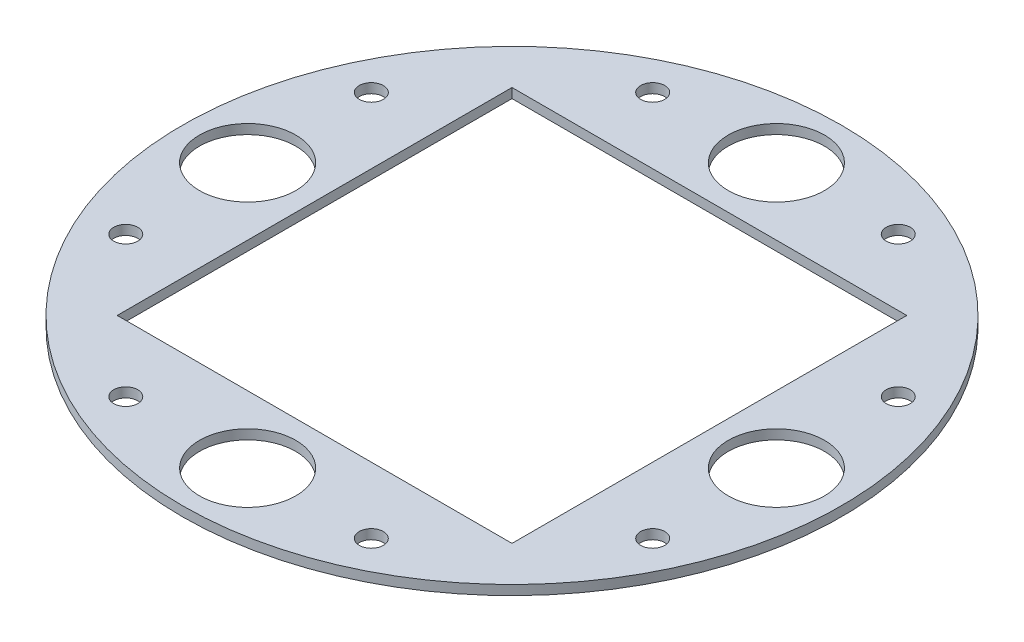
ISO-10303-21;
HEADER;
FILE_DESCRIPTION(('STEP AP214'),'2;1');
FILE_NAME('part.step','',(''),(''),'','','');
FILE_SCHEMA(('AUTOMOTIVE_DESIGN { 1 0 10303 214 1 1 1 1 }'));
ENDSEC;
DATA;
#1=APPLICATION_CONTEXT('core data for automotive mechanical design processes');
#2=APPLICATION_PROTOCOL_DEFINITION('international standard','automotive_design',2000,#1);
#3=PRODUCT_CONTEXT('',#1,'mechanical');
#4=PRODUCT('Part','Part','',(#3));
#5=PRODUCT_RELATED_PRODUCT_CATEGORY('part','',(#4));
#6=PRODUCT_DEFINITION_FORMATION('','',#4);
#7=PRODUCT_DEFINITION_CONTEXT('part definition',#1,'design');
#8=PRODUCT_DEFINITION('design','',#6,#7);
#9=PRODUCT_DEFINITION_SHAPE('','',#8);
#10=(LENGTH_UNIT() NAMED_UNIT(*) SI_UNIT(.MILLI.,.METRE.));
#11=(NAMED_UNIT(*) PLANE_ANGLE_UNIT() SI_UNIT($,.RADIAN.));
#12=(NAMED_UNIT(*) SI_UNIT($,.STERADIAN.) SOLID_ANGLE_UNIT());
#13=UNCERTAINTY_MEASURE_WITH_UNIT(LENGTH_MEASURE(1.E-05),#10,'distance_accuracy_value','');
#14=(GEOMETRIC_REPRESENTATION_CONTEXT(3) GLOBAL_UNCERTAINTY_ASSIGNED_CONTEXT((#13)) GLOBAL_UNIT_ASSIGNED_CONTEXT((#10,
#11,#12)) REPRESENTATION_CONTEXT('',''));
#15=CARTESIAN_POINT('',(0.,0.,0.));
#16=DIRECTION('',(0.,0.,1.));
#17=DIRECTION('',(1.,0.,0.));
#18=AXIS2_PLACEMENT_3D('',#15,#16,#17);
#19=CARTESIAN_POINT('',(0.,2.54,0.));
#20=DIRECTION('',(0.,1.,0.));
#21=DIRECTION('',(0.,0.,1.));
#22=AXIS2_PLACEMENT_3D('',#19,#20,#21);
#23=PLANE('',#22);
#24=CARTESIAN_POINT('',(2.43490429362446E-13,2.54,69.7384306923214));
#25=DIRECTION('',(0.,1.,0.));
#26=DIRECTION('',(1.,0.,0.));
#27=AXIS2_PLACEMENT_3D('',#24,#25,#26);
#28=CIRCLE('',#27,12.7);
#29=CARTESIAN_POINT('',(12.7000000000002,2.54,69.7384306923214));
#30=VERTEX_POINT('',#29);
#31=EDGE_CURVE('E209',#30,#30,#28,.T.);
#32=ORIENTED_EDGE('',*,*,#31,.F.);
#33=EDGE_LOOP('',(#32));
#34=FACE_BOUND('',#33,.T.);
#35=CARTESIAN_POINT('',(69.7384306923214,2.54,0.));
#36=DIRECTION('',(0.,1.,0.));
#37=DIRECTION('',(0.,0.,-1.));
#38=AXIS2_PLACEMENT_3D('',#35,#36,#37);
#39=CIRCLE('',#38,12.7);
#40=CARTESIAN_POINT('',(69.7384306923214,2.54,-12.7));
#41=VERTEX_POINT('',#40);
#42=EDGE_CURVE('E215',#41,#41,#39,.T.);
#43=ORIENTED_EDGE('',*,*,#42,.F.);
#44=EDGE_LOOP('',(#43));
#45=FACE_BOUND('',#44,.T.);
#46=CARTESIAN_POINT('',(-7.30471288087337E-13,2.54,-69.7384306923214));
#47=DIRECTION('',(0.,1.,0.));
#48=DIRECTION('',(-1.,0.,0.));
#49=AXIS2_PLACEMENT_3D('',#46,#47,#48);
#50=CIRCLE('',#49,12.7);
#51=CARTESIAN_POINT('',(-12.7000000000007,2.54,-69.7384306923213));
#52=VERTEX_POINT('',#51);
#53=EDGE_CURVE('E223',#52,#52,#50,.T.);
#54=ORIENTED_EDGE('',*,*,#53,.F.);
#55=EDGE_LOOP('',(#54));
#56=FACE_BOUND('',#55,.T.);
#57=CARTESIAN_POINT('',(-69.7384306923214,2.54,0.));
#58=DIRECTION('',(0.,1.,0.));
#59=DIRECTION('',(0.,0.,1.));
#60=AXIS2_PLACEMENT_3D('',#57,#58,#59);
#61=CIRCLE('',#60,12.7);
#62=CARTESIAN_POINT('',(-69.7384306923214,2.54,12.7));
#63=VERTEX_POINT('',#62);
#64=EDGE_CURVE('E212',#63,#63,#61,.T.);
#65=ORIENTED_EDGE('',*,*,#64,.F.);
#66=EDGE_LOOP('',(#65));
#67=FACE_BOUND('',#66,.T.);
#68=CARTESIAN_POINT('',(-69.50075,2.54,-32.385));
#69=DIRECTION('',(0.,-1.,0.));
#70=DIRECTION('',(0.,0.,-1.));
#71=AXIS2_PLACEMENT_3D('',#68,#69,#70);
#72=CIRCLE('',#71,3.175);
#73=CARTESIAN_POINT('',(-69.50075,2.54,-35.56));
#74=VERTEX_POINT('',#73);
#75=EDGE_CURVE('E250',#74,#74,#72,.T.);
#76=ORIENTED_EDGE('',*,*,#75,.T.);
#77=EDGE_LOOP('',(#76));
#78=FACE_BOUND('',#77,.T.);
#79=CARTESIAN_POINT('',(32.385,2.54,-69.50075));
#80=DIRECTION('',(0.,-1.,0.));
#81=DIRECTION('',(0.,0.,-1.));
#82=AXIS2_PLACEMENT_3D('',#79,#80,#81);
#83=CIRCLE('',#82,3.175);
#84=CARTESIAN_POINT('',(32.385,2.54,-72.67575));
#85=VERTEX_POINT('',#84);
#86=EDGE_CURVE('E232',#85,#85,#83,.T.);
#87=ORIENTED_EDGE('',*,*,#86,.T.);
#88=EDGE_LOOP('',(#87));
#89=FACE_BOUND('',#88,.T.);
#90=CARTESIAN_POINT('',(69.50075,2.54,32.385));
#91=DIRECTION('',(0.,-1.,0.));
#92=DIRECTION('',(0.,0.,-1.));
#93=AXIS2_PLACEMENT_3D('',#90,#91,#92);
#94=CIRCLE('',#93,3.17500000000001);
#95=CARTESIAN_POINT('',(69.50075,2.54,29.21));
#96=VERTEX_POINT('',#95);
#97=EDGE_CURVE('E239',#96,#96,#94,.T.);
#98=ORIENTED_EDGE('',*,*,#97,.T.);
#99=EDGE_LOOP('',(#98));
#100=FACE_BOUND('',#99,.T.);
#101=CARTESIAN_POINT('',(-32.385,2.54,69.50075));
#102=DIRECTION('',(0.,1.,0.));
#103=DIRECTION('',(0.,0.,1.));
#104=AXIS2_PLACEMENT_3D('',#101,#102,#103);
#105=CIRCLE('',#104,3.175);
#106=CARTESIAN_POINT('',(-32.385,2.54,72.67575));
#107=VERTEX_POINT('',#106);
#108=EDGE_CURVE('E107',#107,#107,#105,.F.);
#109=ORIENTED_EDGE('',*,*,#108,.T.);
#110=EDGE_LOOP('',(#109));
#111=FACE_BOUND('',#110,.T.);
#112=DIRECTION('',(0.,0.,-1.));
#113=VECTOR('',#112,1.);
#114=CARTESIAN_POINT('',(52.07,2.54,-52.07));
#115=LINE('',#114,#113);
#116=CARTESIAN_POINT('',(52.07,2.54,52.07));
#117=VERTEX_POINT('',#116);
#118=CARTESIAN_POINT('',(52.07,2.54,-52.07));
#119=VERTEX_POINT('',#118);
#120=EDGE_CURVE('E57',#117,#119,#115,.T.);
#121=ORIENTED_EDGE('',*,*,#120,.F.);
#122=DIRECTION('',(1.,0.,0.));
#123=VECTOR('',#122,1.);
#124=CARTESIAN_POINT('',(-52.07,2.54,52.07));
#125=LINE('',#124,#123);
#126=CARTESIAN_POINT('',(-52.07,2.54,52.07));
#127=VERTEX_POINT('',#126);
#128=EDGE_CURVE('E101',#127,#117,#125,.T.);
#129=ORIENTED_EDGE('',*,*,#128,.F.);
#130=DIRECTION('',(0.,0.,1.));
#131=VECTOR('',#130,1.);
#132=CARTESIAN_POINT('',(-52.07,2.54,-52.07));
#133=LINE('',#132,#131);
#134=CARTESIAN_POINT('',(-52.07,2.54,-52.07));
#135=VERTEX_POINT('',#134);
#136=EDGE_CURVE('E104',#135,#127,#133,.T.);
#137=ORIENTED_EDGE('',*,*,#136,.F.);
#138=DIRECTION('',(-1.,0.,0.));
#139=VECTOR('',#138,1.);
#140=CARTESIAN_POINT('',(-52.07,2.54,-52.07));
#141=LINE('',#140,#139);
#142=EDGE_CURVE('E113',#119,#135,#141,.T.);
#143=ORIENTED_EDGE('',*,*,#142,.F.);
#144=EDGE_LOOP('',(#121,#129,#137,#143));
#145=FACE_BOUND('',#144,.T.);
#146=CARTESIAN_POINT('',(0.,2.54,0.));
#147=DIRECTION('',(0.,1.,0.));
#148=DIRECTION('',(0.,0.,1.));
#149=AXIS2_PLACEMENT_3D('',#146,#147,#148);
#150=CIRCLE('',#149,86.9315);
#151=CARTESIAN_POINT('',(0.,2.54,86.9315));
#152=VERTEX_POINT('',#151);
#153=EDGE_CURVE('E11',#152,#152,#150,.T.);
#154=ORIENTED_EDGE('',*,*,#153,.T.);
#155=EDGE_LOOP('',(#154));
#156=FACE_BOUND('',#155,.T.);
#157=CARTESIAN_POINT('',(32.385,2.54,69.50075));
#158=DIRECTION('',(0.,1.,0.));
#159=DIRECTION('',(0.,0.,1.));
#160=AXIS2_PLACEMENT_3D('',#157,#158,#159);
#161=CIRCLE('',#160,3.175);
#162=CARTESIAN_POINT('',(32.385,2.54,72.67575));
#163=VERTEX_POINT('',#162);
#164=EDGE_CURVE('E245',#163,#163,#161,.T.);
#165=ORIENTED_EDGE('',*,*,#164,.F.);
#166=EDGE_LOOP('',(#165));
#167=FACE_BOUND('',#166,.T.);
#168=CARTESIAN_POINT('',(-69.50075,2.54,32.385));
#169=DIRECTION('',(0.,1.,0.));
#170=DIRECTION('',(0.,0.,1.));
#171=AXIS2_PLACEMENT_3D('',#168,#169,#170);
#172=CIRCLE('',#171,3.17500000000001);
#173=CARTESIAN_POINT('',(-69.50075,2.54,35.5600000000001));
#174=VERTEX_POINT('',#173);
#175=EDGE_CURVE('E262',#174,#174,#172,.T.);
#176=ORIENTED_EDGE('',*,*,#175,.F.);
#177=EDGE_LOOP('',(#176));
#178=FACE_BOUND('',#177,.T.);
#179=CARTESIAN_POINT('',(69.50075,2.54,-32.385));
#180=DIRECTION('',(0.,1.,0.));
#181=DIRECTION('',(0.,0.,1.));
#182=AXIS2_PLACEMENT_3D('',#179,#180,#181);
#183=CIRCLE('',#182,3.175);
#184=CARTESIAN_POINT('',(69.50075,2.54,-29.21));
#185=VERTEX_POINT('',#184);
#186=EDGE_CURVE('E268',#185,#185,#183,.T.);
#187=ORIENTED_EDGE('',*,*,#186,.F.);
#188=EDGE_LOOP('',(#187));
#189=FACE_BOUND('',#188,.T.);
#190=CARTESIAN_POINT('',(-32.385,2.54,-69.50075));
#191=DIRECTION('',(0.,1.,0.));
#192=DIRECTION('',(0.,0.,1.));
#193=AXIS2_PLACEMENT_3D('',#190,#191,#192);
#194=CIRCLE('',#193,3.175);
#195=CARTESIAN_POINT('',(-32.385,2.54,-66.32575));
#196=VERTEX_POINT('',#195);
#197=EDGE_CURVE('E257',#196,#196,#194,.T.);
#198=ORIENTED_EDGE('',*,*,#197,.F.);
#199=EDGE_LOOP('',(#198));
#200=FACE_BOUND('',#199,.T.);
#201=ADVANCED_FACE('F42',(#34,#45,#56,#67,#78,#89,#100,#111,#145,#156,#167,#178,#189,#200),#23,.T.);
#202=CARTESIAN_POINT('',(0.,0.,0.));
#203=DIRECTION('',(0.,1.,0.));
#204=DIRECTION('',(0.,0.,1.));
#205=AXIS2_PLACEMENT_3D('',#202,#203,#204);
#206=PLANE('',#205);
#207=CARTESIAN_POINT('',(2.43490429362446E-13,0.,69.7384306923214));
#208=DIRECTION('',(0.,1.,0.));
#209=DIRECTION('',(1.,0.,0.));
#210=AXIS2_PLACEMENT_3D('',#207,#208,#209);
#211=CIRCLE('',#210,12.7);
#212=CARTESIAN_POINT('',(12.7000000000002,0.,69.7384306923214));
#213=VERTEX_POINT('',#212);
#214=EDGE_CURVE('E207',#213,#213,#211,.T.);
#215=ORIENTED_EDGE('',*,*,#214,.T.);
#216=EDGE_LOOP('',(#215));
#217=FACE_BOUND('',#216,.T.);
#218=CARTESIAN_POINT('',(69.7384306923214,0.,0.));
#219=DIRECTION('',(0.,1.,0.));
#220=DIRECTION('',(0.,0.,-1.));
#221=AXIS2_PLACEMENT_3D('',#218,#219,#220);
#222=CIRCLE('',#221,12.7);
#223=CARTESIAN_POINT('',(69.7384306923214,0.,-12.7));
#224=VERTEX_POINT('',#223);
#225=EDGE_CURVE('E210',#224,#224,#222,.T.);
#226=ORIENTED_EDGE('',*,*,#225,.T.);
#227=EDGE_LOOP('',(#226));
#228=FACE_BOUND('',#227,.T.);
#229=CARTESIAN_POINT('',(-7.30471288087337E-13,0.,-69.7384306923214));
#230=DIRECTION('',(0.,1.,0.));
#231=DIRECTION('',(-1.,0.,0.));
#232=AXIS2_PLACEMENT_3D('',#229,#230,#231);
#233=CIRCLE('',#232,12.7);
#234=CARTESIAN_POINT('',(-12.7000000000007,0.,-69.7384306923213));
#235=VERTEX_POINT('',#234);
#236=EDGE_CURVE('E220',#235,#235,#233,.T.);
#237=ORIENTED_EDGE('',*,*,#236,.T.);
#238=EDGE_LOOP('',(#237));
#239=FACE_BOUND('',#238,.T.);
#240=CARTESIAN_POINT('',(-69.7384306923214,0.,0.));
#241=DIRECTION('',(0.,1.,0.));
#242=DIRECTION('',(0.,0.,1.));
#243=AXIS2_PLACEMENT_3D('',#240,#241,#242);
#244=CIRCLE('',#243,12.7);
#245=CARTESIAN_POINT('',(-69.7384306923214,0.,12.7));
#246=VERTEX_POINT('',#245);
#247=EDGE_CURVE('E226',#246,#246,#244,.T.);
#248=ORIENTED_EDGE('',*,*,#247,.T.);
#249=EDGE_LOOP('',(#248));
#250=FACE_BOUND('',#249,.T.);
#251=CARTESIAN_POINT('',(69.50075,0.,-32.385));
#252=DIRECTION('',(0.,1.,0.));
#253=DIRECTION('',(0.,0.,1.));
#254=AXIS2_PLACEMENT_3D('',#251,#252,#253);
#255=CIRCLE('',#254,3.175);
#256=CARTESIAN_POINT('',(69.50075,0.,-29.21));
#257=VERTEX_POINT('',#256);
#258=EDGE_CURVE('E253',#257,#257,#255,.T.);
#259=ORIENTED_EDGE('',*,*,#258,.T.);
#260=EDGE_LOOP('',(#259));
#261=FACE_BOUND('',#260,.T.);
#262=CARTESIAN_POINT('',(32.385,0.,69.50075));
#263=DIRECTION('',(0.,1.,0.));
#264=DIRECTION('',(0.,0.,1.));
#265=AXIS2_PLACEMENT_3D('',#262,#263,#264);
#266=CIRCLE('',#265,3.175);
#267=CARTESIAN_POINT('',(32.385,0.,72.67575));
#268=VERTEX_POINT('',#267);
#269=EDGE_CURVE('E229',#268,#268,#266,.T.);
#270=ORIENTED_EDGE('',*,*,#269,.T.);
#271=EDGE_LOOP('',(#270));
#272=FACE_BOUND('',#271,.T.);
#273=CARTESIAN_POINT('',(-32.385,0.,69.50075));
#274=DIRECTION('',(0.,1.,0.));
#275=DIRECTION('',(0.,0.,1.));
#276=AXIS2_PLACEMENT_3D('',#273,#274,#275);
#277=CIRCLE('',#276,3.175);
#278=CARTESIAN_POINT('',(-32.385,0.,72.67575));
#279=VERTEX_POINT('',#278);
#280=EDGE_CURVE('E114',#279,#279,#277,.F.);
#281=ORIENTED_EDGE('',*,*,#280,.F.);
#282=EDGE_LOOP('',(#281));
#283=FACE_BOUND('',#282,.T.);
#284=DIRECTION('',(1.,0.,0.));
#285=VECTOR('',#284,1.);
#286=CARTESIAN_POINT('',(-52.07,0.,52.07));
#287=LINE('',#286,#285);
#288=CARTESIAN_POINT('',(-52.07,0.,52.07));
#289=VERTEX_POINT('',#288);
#290=CARTESIAN_POINT('',(52.07,0.,52.07));
#291=VERTEX_POINT('',#290);
#292=EDGE_CURVE('E91',#289,#291,#287,.T.);
#293=ORIENTED_EDGE('',*,*,#292,.T.);
#294=DIRECTION('',(0.,0.,-1.));
#295=VECTOR('',#294,1.);
#296=CARTESIAN_POINT('',(52.07,0.,-52.07));
#297=LINE('',#296,#295);
#298=CARTESIAN_POINT('',(52.07,0.,-52.07));
#299=VERTEX_POINT('',#298);
#300=EDGE_CURVE('E85',#291,#299,#297,.T.);
#301=ORIENTED_EDGE('',*,*,#300,.T.);
#302=DIRECTION('',(-1.,0.,0.));
#303=VECTOR('',#302,1.);
#304=CARTESIAN_POINT('',(-52.07,0.,-52.07));
#305=LINE('',#304,#303);
#306=CARTESIAN_POINT('',(-52.07,0.,-52.07));
#307=VERTEX_POINT('',#306);
#308=EDGE_CURVE('E94',#299,#307,#305,.T.);
#309=ORIENTED_EDGE('',*,*,#308,.T.);
#310=DIRECTION('',(0.,0.,1.));
#311=VECTOR('',#310,1.);
#312=CARTESIAN_POINT('',(-52.07,0.,-52.07));
#313=LINE('',#312,#311);
#314=EDGE_CURVE('E65',#307,#289,#313,.T.);
#315=ORIENTED_EDGE('',*,*,#314,.T.);
#316=EDGE_LOOP('',(#293,#301,#309,#315));
#317=FACE_BOUND('',#316,.T.);
#318=CARTESIAN_POINT('',(0.,0.,0.));
#319=DIRECTION('',(0.,1.,0.));
#320=DIRECTION('',(0.,0.,1.));
#321=AXIS2_PLACEMENT_3D('',#318,#319,#320);
#322=CIRCLE('',#321,86.9315);
#323=CARTESIAN_POINT('',(0.,0.,86.9315));
#324=VERTEX_POINT('',#323);
#325=EDGE_CURVE('E46',#324,#324,#322,.T.);
#326=ORIENTED_EDGE('',*,*,#325,.F.);
#327=EDGE_LOOP('',(#326));
#328=FACE_BOUND('',#327,.T.);
#329=CARTESIAN_POINT('',(69.50075,0.,32.385));
#330=DIRECTION('',(0.,-1.,0.));
#331=DIRECTION('',(0.,0.,-1.));
#332=AXIS2_PLACEMENT_3D('',#329,#330,#331);
#333=CIRCLE('',#332,3.17500000000001);
#334=CARTESIAN_POINT('',(69.50075,0.,29.21));
#335=VERTEX_POINT('',#334);
#336=EDGE_CURVE('E242',#335,#335,#333,.T.);
#337=ORIENTED_EDGE('',*,*,#336,.F.);
#338=EDGE_LOOP('',(#337));
#339=FACE_BOUND('',#338,.T.);
#340=CARTESIAN_POINT('',(32.385,0.,-69.50075));
#341=DIRECTION('',(0.,-1.,0.));
#342=DIRECTION('',(0.,0.,-1.));
#343=AXIS2_PLACEMENT_3D('',#340,#341,#342);
#344=CIRCLE('',#343,3.175);
#345=CARTESIAN_POINT('',(32.385,0.,-72.67575));
#346=VERTEX_POINT('',#345);
#347=EDGE_CURVE('E236',#346,#346,#344,.T.);
#348=ORIENTED_EDGE('',*,*,#347,.F.);
#349=EDGE_LOOP('',(#348));
#350=FACE_BOUND('',#349,.T.);
#351=CARTESIAN_POINT('',(-69.50075,0.,32.385));
#352=DIRECTION('',(0.,1.,0.));
#353=DIRECTION('',(0.,0.,1.));
#354=AXIS2_PLACEMENT_3D('',#351,#352,#353);
#355=CIRCLE('',#354,3.17500000000001);
#356=CARTESIAN_POINT('',(-69.50075,0.,35.5600000000001));
#357=VERTEX_POINT('',#356);
#358=EDGE_CURVE('E265',#357,#357,#355,.T.);
#359=ORIENTED_EDGE('',*,*,#358,.T.);
#360=EDGE_LOOP('',(#359));
#361=FACE_BOUND('',#360,.T.);
#362=CARTESIAN_POINT('',(-69.50075,0.,-32.385));
#363=DIRECTION('',(0.,-1.,0.));
#364=DIRECTION('',(0.,0.,-1.));
#365=AXIS2_PLACEMENT_3D('',#362,#363,#364);
#366=CIRCLE('',#365,3.175);
#367=CARTESIAN_POINT('',(-69.50075,0.,-35.56));
#368=VERTEX_POINT('',#367);
#369=EDGE_CURVE('E254',#368,#368,#366,.T.);
#370=ORIENTED_EDGE('',*,*,#369,.F.);
#371=EDGE_LOOP('',(#370));
#372=FACE_BOUND('',#371,.T.);
#373=CARTESIAN_POINT('',(-32.385,0.,-69.50075));
#374=DIRECTION('',(0.,1.,0.));
#375=DIRECTION('',(0.,0.,1.));
#376=AXIS2_PLACEMENT_3D('',#373,#374,#375);
#377=CIRCLE('',#376,3.175);
#378=CARTESIAN_POINT('',(-32.385,0.,-66.32575));
#379=VERTEX_POINT('',#378);
#380=EDGE_CURVE('E235',#379,#379,#377,.T.);
#381=ORIENTED_EDGE('',*,*,#380,.T.);
#382=EDGE_LOOP('',(#381));
#383=FACE_BOUND('',#382,.T.);
#384=ADVANCED_FACE('F98',(#217,#228,#239,#250,#261,#272,#283,#317,#328,#339,#350,#361,#372,
#383),#206,.F.);
#385=CARTESIAN_POINT('',(0.,2.54,0.));
#386=DIRECTION('',(0.,-1.,0.));
#387=DIRECTION('',(0.,0.,-1.));
#388=AXIS2_PLACEMENT_3D('',#385,#386,#387);
#389=CYLINDRICAL_SURFACE('',#388,86.9315);
#390=ORIENTED_EDGE('',*,*,#153,.F.);
#391=EDGE_LOOP('',(#390));
#392=FACE_BOUND('',#391,.T.);
#393=ORIENTED_EDGE('',*,*,#325,.T.);
#394=EDGE_LOOP('',(#393));
#395=FACE_BOUND('',#394,.T.);
#396=ADVANCED_FACE('F44',(#392,#395),#389,.T.);
#397=CARTESIAN_POINT('',(52.07,0.,-52.07));
#398=DIRECTION('',(1.,0.,0.));
#399=DIRECTION('',(0.,0.,-1.));
#400=AXIS2_PLACEMENT_3D('',#397,#398,#399);
#401=PLANE('',#400);
#402=ORIENTED_EDGE('',*,*,#120,.T.);
#403=DIRECTION('',(0.,1.,0.));
#404=VECTOR('',#403,1.);
#405=CARTESIAN_POINT('',(52.07,0.,-52.07));
#406=LINE('',#405,#404);
#407=EDGE_CURVE('E81',#299,#119,#406,.T.);
#408=ORIENTED_EDGE('',*,*,#407,.F.);
#409=ORIENTED_EDGE('',*,*,#300,.F.);
#410=DIRECTION('',(0.,1.,0.));
#411=VECTOR('',#410,1.);
#412=CARTESIAN_POINT('',(52.07,0.,52.07));
#413=LINE('',#412,#411);
#414=EDGE_CURVE('E118',#291,#117,#413,.T.);
#415=ORIENTED_EDGE('',*,*,#414,.T.);
#416=EDGE_LOOP('',(#402,#408,#409,#415));
#417=FACE_BOUND('',#416,.T.);
#418=ADVANCED_FACE('F83',(#417),#401,.F.);
#419=CARTESIAN_POINT('',(-52.07,0.,52.07));
#420=DIRECTION('',(0.,0.,1.));
#421=DIRECTION('',(1.,0.,0.));
#422=AXIS2_PLACEMENT_3D('',#419,#420,#421);
#423=PLANE('',#422);
#424=ORIENTED_EDGE('',*,*,#128,.T.);
#425=ORIENTED_EDGE('',*,*,#414,.F.);
#426=ORIENTED_EDGE('',*,*,#292,.F.);
#427=DIRECTION('',(0.,1.,0.));
#428=VECTOR('',#427,1.);
#429=CARTESIAN_POINT('',(-52.07,0.,52.07));
#430=LINE('',#429,#428);
#431=EDGE_CURVE('E120',#289,#127,#430,.T.);
#432=ORIENTED_EDGE('',*,*,#431,.T.);
#433=EDGE_LOOP('',(#424,#425,#426,#432));
#434=FACE_BOUND('',#433,.T.);
#435=ADVANCED_FACE('F128',(#434),#423,.F.);
#436=CARTESIAN_POINT('',(-52.07,0.,-52.07));
#437=DIRECTION('',(-1.,0.,0.));
#438=DIRECTION('',(0.,0.,1.));
#439=AXIS2_PLACEMENT_3D('',#436,#437,#438);
#440=PLANE('',#439);
#441=ORIENTED_EDGE('',*,*,#136,.T.);
#442=ORIENTED_EDGE('',*,*,#431,.F.);
#443=ORIENTED_EDGE('',*,*,#314,.F.);
#444=DIRECTION('',(0.,1.,0.));
#445=VECTOR('',#444,1.);
#446=CARTESIAN_POINT('',(-52.07,0.,-52.07));
#447=LINE('',#446,#445);
#448=EDGE_CURVE('E90',#307,#135,#447,.T.);
#449=ORIENTED_EDGE('',*,*,#448,.T.);
#450=EDGE_LOOP('',(#441,#442,#443,#449));
#451=FACE_BOUND('',#450,.T.);
#452=ADVANCED_FACE('F122',(#451),#440,.F.);
#453=CARTESIAN_POINT('',(-52.07,0.,-52.07));
#454=DIRECTION('',(0.,0.,-1.));
#455=DIRECTION('',(-1.,0.,0.));
#456=AXIS2_PLACEMENT_3D('',#453,#454,#455);
#457=PLANE('',#456);
#458=ORIENTED_EDGE('',*,*,#142,.T.);
#459=ORIENTED_EDGE('',*,*,#448,.F.);
#460=ORIENTED_EDGE('',*,*,#308,.F.);
#461=ORIENTED_EDGE('',*,*,#407,.T.);
#462=EDGE_LOOP('',(#458,#459,#460,#461));
#463=FACE_BOUND('',#462,.T.);
#464=ADVANCED_FACE('F95',(#463),#457,.F.);
#465=CARTESIAN_POINT('',(-32.385,0.,69.50075));
#466=DIRECTION('',(0.,1.,0.));
#467=DIRECTION('',(0.,0.,1.));
#468=AXIS2_PLACEMENT_3D('',#465,#466,#467);
#469=CYLINDRICAL_SURFACE('',#468,3.175);
#470=ORIENTED_EDGE('',*,*,#280,.T.);
#471=EDGE_LOOP('',(#470));
#472=FACE_BOUND('',#471,.T.);
#473=ORIENTED_EDGE('',*,*,#108,.F.);
#474=EDGE_LOOP('',(#473));
#475=FACE_BOUND('',#474,.T.);
#476=ADVANCED_FACE('F150',(#472,#475),#469,.F.);
#477=CARTESIAN_POINT('',(32.385,0.,69.50075));
#478=DIRECTION('',(0.,1.,0.));
#479=DIRECTION('',(0.,0.,1.));
#480=AXIS2_PLACEMENT_3D('',#477,#478,#479);
#481=CYLINDRICAL_SURFACE('',#480,3.175);
#482=ORIENTED_EDGE('',*,*,#269,.F.);
#483=EDGE_LOOP('',(#482));
#484=FACE_BOUND('',#483,.T.);
#485=ORIENTED_EDGE('',*,*,#164,.T.);
#486=EDGE_LOOP('',(#485));
#487=FACE_BOUND('',#486,.T.);
#488=ADVANCED_FACE('F154',(#484,#487),#481,.F.);
#489=CARTESIAN_POINT('',(69.50075,0.,32.385));
#490=DIRECTION('',(0.,1.,0.));
#491=DIRECTION('',(0.,0.,1.));
#492=AXIS2_PLACEMENT_3D('',#489,#490,#491);
#493=CYLINDRICAL_SURFACE('',#492,3.17500000000001);
#494=ORIENTED_EDGE('',*,*,#336,.T.);
#495=EDGE_LOOP('',(#494));
#496=FACE_BOUND('',#495,.T.);
#497=ORIENTED_EDGE('',*,*,#97,.F.);
#498=EDGE_LOOP('',(#497));
#499=FACE_BOUND('',#498,.T.);
#500=ADVANCED_FACE('F159',(#496,#499),#493,.F.);
#501=CARTESIAN_POINT('',(32.385,0.,-69.50075));
#502=DIRECTION('',(0.,1.,0.));
#503=DIRECTION('',(0.,0.,1.));
#504=AXIS2_PLACEMENT_3D('',#501,#502,#503);
#505=CYLINDRICAL_SURFACE('',#504,3.175);
#506=ORIENTED_EDGE('',*,*,#347,.T.);
#507=EDGE_LOOP('',(#506));
#508=FACE_BOUND('',#507,.T.);
#509=ORIENTED_EDGE('',*,*,#86,.F.);
#510=EDGE_LOOP('',(#509));
#511=FACE_BOUND('',#510,.T.);
#512=ADVANCED_FACE('F173',(#508,#511),#505,.F.);
#513=CARTESIAN_POINT('',(-69.50075,0.,32.385));
#514=DIRECTION('',(0.,1.,0.));
#515=DIRECTION('',(0.,0.,1.));
#516=AXIS2_PLACEMENT_3D('',#513,#514,#515);
#517=CYLINDRICAL_SURFACE('',#516,3.17500000000001);
#518=ORIENTED_EDGE('',*,*,#358,.F.);
#519=EDGE_LOOP('',(#518));
#520=FACE_BOUND('',#519,.T.);
#521=ORIENTED_EDGE('',*,*,#175,.T.);
#522=EDGE_LOOP('',(#521));
#523=FACE_BOUND('',#522,.T.);
#524=ADVANCED_FACE('F169',(#520,#523),#517,.F.);
#525=CARTESIAN_POINT('',(69.50075,0.,-32.385));
#526=DIRECTION('',(0.,1.,0.));
#527=DIRECTION('',(0.,0.,1.));
#528=AXIS2_PLACEMENT_3D('',#525,#526,#527);
#529=CYLINDRICAL_SURFACE('',#528,3.175);
#530=ORIENTED_EDGE('',*,*,#258,.F.);
#531=EDGE_LOOP('',(#530));
#532=FACE_BOUND('',#531,.T.);
#533=ORIENTED_EDGE('',*,*,#186,.T.);
#534=EDGE_LOOP('',(#533));
#535=FACE_BOUND('',#534,.T.);
#536=ADVANCED_FACE('F165',(#532,#535),#529,.F.);
#537=CARTESIAN_POINT('',(-69.50075,0.,-32.385));
#538=DIRECTION('',(0.,1.,0.));
#539=DIRECTION('',(0.,0.,1.));
#540=AXIS2_PLACEMENT_3D('',#537,#538,#539);
#541=CYLINDRICAL_SURFACE('',#540,3.175);
#542=ORIENTED_EDGE('',*,*,#369,.T.);
#543=EDGE_LOOP('',(#542));
#544=FACE_BOUND('',#543,.T.);
#545=ORIENTED_EDGE('',*,*,#75,.F.);
#546=EDGE_LOOP('',(#545));
#547=FACE_BOUND('',#546,.T.);
#548=ADVANCED_FACE('F168',(#544,#547),#541,.F.);
#549=CARTESIAN_POINT('',(-32.385,0.,-69.50075));
#550=DIRECTION('',(0.,1.,0.));
#551=DIRECTION('',(0.,0.,1.));
#552=AXIS2_PLACEMENT_3D('',#549,#550,#551);
#553=CYLINDRICAL_SURFACE('',#552,3.175);
#554=ORIENTED_EDGE('',*,*,#380,.F.);
#555=EDGE_LOOP('',(#554));
#556=FACE_BOUND('',#555,.T.);
#557=ORIENTED_EDGE('',*,*,#197,.T.);
#558=EDGE_LOOP('',(#557));
#559=FACE_BOUND('',#558,.T.);
#560=ADVANCED_FACE('F175',(#556,#559),#553,.F.);
#561=CARTESIAN_POINT('',(-69.7384306923214,0.,0.));
#562=DIRECTION('',(0.,1.,0.));
#563=DIRECTION('',(0.,0.,1.));
#564=AXIS2_PLACEMENT_3D('',#561,#562,#563);
#565=CYLINDRICAL_SURFACE('',#564,12.7);
#566=ORIENTED_EDGE('',*,*,#247,.F.);
#567=EDGE_LOOP('',(#566));
#568=FACE_BOUND('',#567,.T.);
#569=ORIENTED_EDGE('',*,*,#64,.T.);
#570=EDGE_LOOP('',(#569));
#571=FACE_BOUND('',#570,.T.);
#572=ADVANCED_FACE('F178',(#568,#571),#565,.F.);
#573=CARTESIAN_POINT('',(-7.30471288087337E-13,0.,-69.7384306923214));
#574=DIRECTION('',(0.,1.,0.));
#575=DIRECTION('',(0.,0.,1.));
#576=AXIS2_PLACEMENT_3D('',#573,#574,#575);
#577=CYLINDRICAL_SURFACE('',#576,12.7);
#578=ORIENTED_EDGE('',*,*,#236,.F.);
#579=EDGE_LOOP('',(#578));
#580=FACE_BOUND('',#579,.T.);
#581=ORIENTED_EDGE('',*,*,#53,.T.);
#582=EDGE_LOOP('',(#581));
#583=FACE_BOUND('',#582,.T.);
#584=ADVANCED_FACE('F190',(#580,#583),#577,.F.);
#585=CARTESIAN_POINT('',(69.7384306923214,0.,0.));
#586=DIRECTION('',(0.,1.,0.));
#587=DIRECTION('',(0.,0.,1.));
#588=AXIS2_PLACEMENT_3D('',#585,#586,#587);
#589=CYLINDRICAL_SURFACE('',#588,12.7);
#590=ORIENTED_EDGE('',*,*,#225,.F.);
#591=EDGE_LOOP('',(#590));
#592=FACE_BOUND('',#591,.T.);
#593=ORIENTED_EDGE('',*,*,#42,.T.);
#594=EDGE_LOOP('',(#593));
#595=FACE_BOUND('',#594,.T.);
#596=ADVANCED_FACE('F194',(#592,#595),#589,.F.);
#597=CARTESIAN_POINT('',(2.43490429362446E-13,0.,69.7384306923214));
#598=DIRECTION('',(0.,1.,0.));
#599=DIRECTION('',(0.,0.,1.));
#600=AXIS2_PLACEMENT_3D('',#597,#598,#599);
#601=CYLINDRICAL_SURFACE('',#600,12.7);
#602=ORIENTED_EDGE('',*,*,#214,.F.);
#603=EDGE_LOOP('',(#602));
#604=FACE_BOUND('',#603,.T.);
#605=ORIENTED_EDGE('',*,*,#31,.T.);
#606=EDGE_LOOP('',(#605));
#607=FACE_BOUND('',#606,.T.);
#608=ADVANCED_FACE('F198',(#604,#607),#601,.F.);
#609=CLOSED_SHELL('',(#201,#384,#396,#418,#435,#452,#464,#476,#488,#500,#512,#524,#536,#548,
#560,#572,#584,#596,#608));
#610=MANIFOLD_SOLID_BREP('B2',#609);
#611=ADVANCED_BREP_SHAPE_REPRESENTATION('',(#18,#610),#14);
#612=SHAPE_DEFINITION_REPRESENTATION(#9,#611);
ENDSEC;
END-ISO-10303-21;
